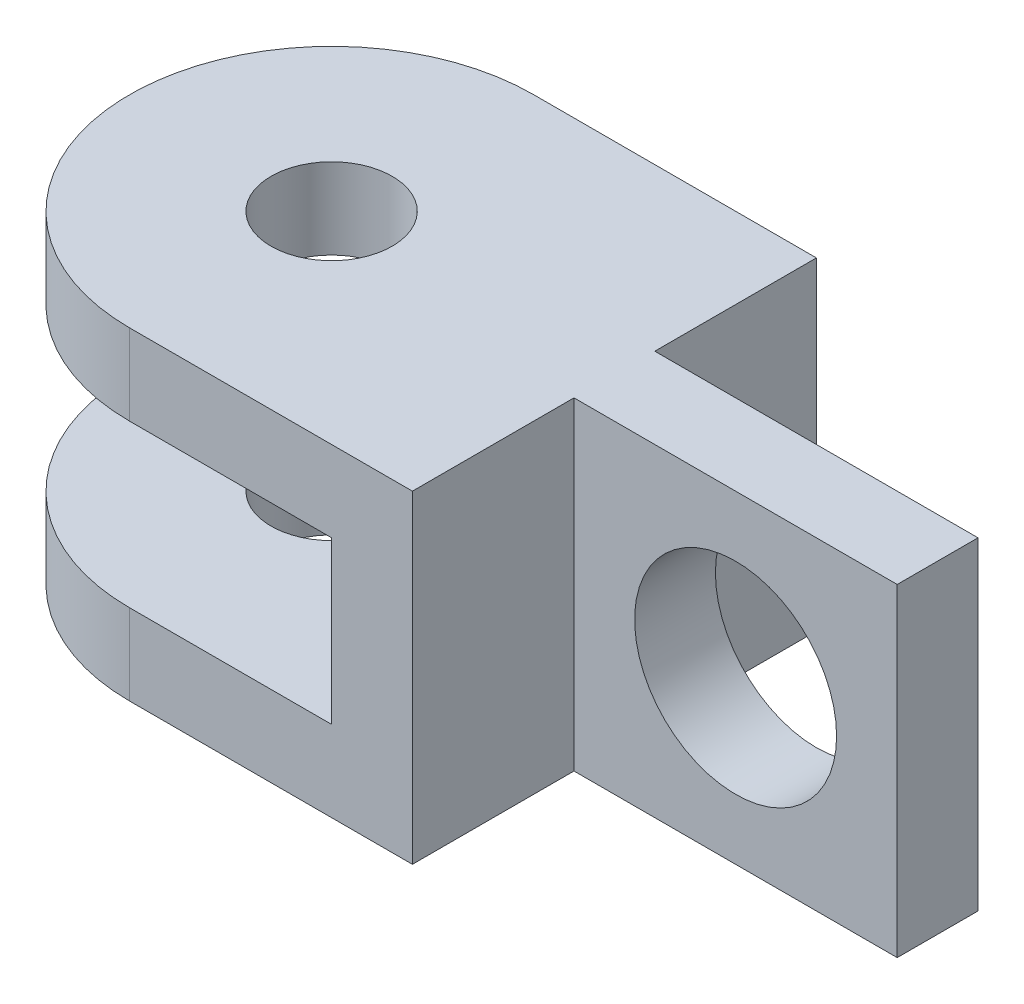
ISO-10303-21;
HEADER;
FILE_DESCRIPTION(('STEP AP214'),'2;1');
FILE_NAME('part.step','',(''),(''),'','','');
FILE_SCHEMA(('AUTOMOTIVE_DESIGN { 1 0 10303 214 1 1 1 1 }'));
ENDSEC;
DATA;
#1=APPLICATION_CONTEXT('core data for automotive mechanical design processes');
#2=APPLICATION_PROTOCOL_DEFINITION('international standard','automotive_design',2000,#1);
#3=PRODUCT_CONTEXT('',#1,'mechanical');
#4=PRODUCT('Part','Part','',(#3));
#5=PRODUCT_RELATED_PRODUCT_CATEGORY('part','',(#4));
#6=PRODUCT_DEFINITION_FORMATION('','',#4);
#7=PRODUCT_DEFINITION_CONTEXT('part definition',#1,'design');
#8=PRODUCT_DEFINITION('design','',#6,#7);
#9=PRODUCT_DEFINITION_SHAPE('','',#8);
#10=(LENGTH_UNIT() NAMED_UNIT(*) SI_UNIT(.MILLI.,.METRE.));
#11=(NAMED_UNIT(*) PLANE_ANGLE_UNIT() SI_UNIT($,.RADIAN.));
#12=(NAMED_UNIT(*) SI_UNIT($,.STERADIAN.) SOLID_ANGLE_UNIT());
#13=UNCERTAINTY_MEASURE_WITH_UNIT(LENGTH_MEASURE(1.E-05),#10,'distance_accuracy_value','');
#14=(GEOMETRIC_REPRESENTATION_CONTEXT(3) GLOBAL_UNCERTAINTY_ASSIGNED_CONTEXT((#13)) GLOBAL_UNIT_ASSIGNED_CONTEXT((#10,
#11,#12)) REPRESENTATION_CONTEXT('',''));
#15=CARTESIAN_POINT('',(0.,0.,0.));
#16=DIRECTION('',(0.,0.,1.));
#17=DIRECTION('',(1.,0.,0.));
#18=AXIS2_PLACEMENT_3D('',#15,#16,#17);
#19=CARTESIAN_POINT('',(200.,80.,0.));
#20=DIRECTION('',(-1.,0.,0.));
#21=DIRECTION('',(0.,0.,1.));
#22=AXIS2_PLACEMENT_3D('',#19,#20,#21);
#23=PLANE('',#22);
#24=DIRECTION('',(0.,-1.,0.));
#25=VECTOR('',#24,1.);
#26=CARTESIAN_POINT('',(200.,80.,40.));
#27=LINE('',#26,#25);
#28=CARTESIAN_POINT('',(200.,80.,40.));
#29=VERTEX_POINT('',#28);
#30=CARTESIAN_POINT('',(200.,0.,40.));
#31=VERTEX_POINT('',#30);
#32=EDGE_CURVE('E150',#29,#31,#27,.T.);
#33=ORIENTED_EDGE('',*,*,#32,.F.);
#34=DIRECTION('',(0.,0.,-1.));
#35=VECTOR('',#34,1.);
#36=CARTESIAN_POINT('',(200.,80.,0.));
#37=LINE('',#36,#35);
#38=CARTESIAN_POINT('',(200.,80.,60.));
#39=VERTEX_POINT('',#38);
#40=EDGE_CURVE('E158',#39,#29,#37,.T.);
#41=ORIENTED_EDGE('',*,*,#40,.F.);
#42=DIRECTION('',(0.,1.,0.));
#43=VECTOR('',#42,1.);
#44=CARTESIAN_POINT('',(200.,80.,60.));
#45=LINE('',#44,#43);
#46=CARTESIAN_POINT('',(200.,0.,60.));
#47=VERTEX_POINT('',#46);
#48=EDGE_CURVE('E209',#47,#39,#45,.T.);
#49=ORIENTED_EDGE('',*,*,#48,.F.);
#50=DIRECTION('',(0.,0.,-1.));
#51=VECTOR('',#50,1.);
#52=CARTESIAN_POINT('',(200.,0.,0.));
#53=LINE('',#52,#51);
#54=EDGE_CURVE('E174',#47,#31,#53,.T.);
#55=ORIENTED_EDGE('',*,*,#54,.T.);
#56=EDGE_LOOP('',(#33,#41,#49,#55));
#57=FACE_BOUND('',#56,.T.);
#58=ADVANCED_FACE('F45',(#57),#23,.F.);
#59=CARTESIAN_POINT('',(160.,40.,0.));
#60=DIRECTION('',(0.,0.,1.));
#61=DIRECTION('',(1.,0.,0.));
#62=AXIS2_PLACEMENT_3D('',#59,#60,#61);
#63=CYLINDRICAL_SURFACE('',#62,25.);
#64=CARTESIAN_POINT('',(160.,40.,60.));
#65=DIRECTION('',(0.,0.,1.));
#66=DIRECTION('',(1.,0.,0.));
#67=AXIS2_PLACEMENT_3D('',#64,#65,#66);
#68=CIRCLE('',#67,25.);
#69=CARTESIAN_POINT('',(185.,40.,60.));
#70=VERTEX_POINT('',#69);
#71=EDGE_CURVE('E206',#70,#70,#68,.F.);
#72=ORIENTED_EDGE('',*,*,#71,.F.);
#73=EDGE_LOOP('',(#72));
#74=FACE_BOUND('',#73,.T.);
#75=CARTESIAN_POINT('',(160.,40.,40.));
#76=DIRECTION('',(0.,0.,-1.));
#77=DIRECTION('',(-1.,0.,0.));
#78=AXIS2_PLACEMENT_3D('',#75,#76,#77);
#79=CIRCLE('',#78,25.);
#80=CARTESIAN_POINT('',(135.,40.,40.));
#81=VERTEX_POINT('',#80);
#82=EDGE_CURVE('E225',#81,#81,#79,.F.);
#83=ORIENTED_EDGE('',*,*,#82,.F.);
#84=EDGE_LOOP('',(#83));
#85=FACE_BOUND('',#84,.T.);
#86=ADVANCED_FACE('F305',(#74,#85),#63,.F.);
#87=CARTESIAN_POINT('',(50.,80.,50.));
#88=DIRECTION('',(0.,-1.,0.));
#89=DIRECTION('',(0.,0.,-1.));
#90=AXIS2_PLACEMENT_3D('',#87,#88,#89);
#91=CYLINDRICAL_SURFACE('',#90,50.);
#92=DIRECTION('',(0.,-1.,0.));
#93=VECTOR('',#92,1.);
#94=CARTESIAN_POINT('',(50.,80.,0.));
#95=LINE('',#94,#93);
#96=CARTESIAN_POINT('',(50.,80.,0.));
#97=VERTEX_POINT('',#96);
#98=CARTESIAN_POINT('',(50.,60.,0.));
#99=VERTEX_POINT('',#98);
#100=EDGE_CURVE('E140',#97,#99,#95,.T.);
#101=ORIENTED_EDGE('',*,*,#100,.T.);
#102=CARTESIAN_POINT('',(50.,60.,50.));
#103=DIRECTION('',(0.,1.,0.));
#104=DIRECTION('',(0.,0.,1.));
#105=AXIS2_PLACEMENT_3D('',#102,#103,#104);
#106=CIRCLE('',#105,50.);
#107=CARTESIAN_POINT('',(50.,60.,100.));
#108=VERTEX_POINT('',#107);
#109=EDGE_CURVE('E205',#99,#108,#106,.T.);
#110=ORIENTED_EDGE('',*,*,#109,.T.);
#111=DIRECTION('',(0.,-1.,0.));
#112=VECTOR('',#111,1.);
#113=CARTESIAN_POINT('',(50.,80.,100.));
#114=LINE('',#113,#112);
#115=CARTESIAN_POINT('',(50.,80.,100.));
#116=VERTEX_POINT('',#115);
#117=EDGE_CURVE('E188',#116,#108,#114,.T.);
#118=ORIENTED_EDGE('',*,*,#117,.F.);
#119=CARTESIAN_POINT('',(50.,80.,50.));
#120=DIRECTION('',(0.,1.,0.));
#121=DIRECTION('',(0.,0.,1.));
#122=AXIS2_PLACEMENT_3D('',#119,#120,#121);
#123=CIRCLE('',#122,50.);
#124=EDGE_CURVE('E157',#97,#116,#123,.T.);
#125=ORIENTED_EDGE('',*,*,#124,.F.);
#126=EDGE_LOOP('',(#101,#110,#118,#125));
#127=FACE_BOUND('',#126,.T.);
#128=ADVANCED_FACE('F302',(#127),#91,.T.);
#129=CARTESIAN_POINT('',(50.,80.,50.));
#130=DIRECTION('',(0.,-1.,0.));
#131=DIRECTION('',(0.,0.,-1.));
#132=AXIS2_PLACEMENT_3D('',#129,#130,#131);
#133=CYLINDRICAL_SURFACE('',#132,15.);
#134=CARTESIAN_POINT('',(50.,60.,50.));
#135=DIRECTION('',(0.,1.,0.));
#136=DIRECTION('',(0.,0.,1.));
#137=AXIS2_PLACEMENT_3D('',#134,#135,#136);
#138=CIRCLE('',#137,15.);
#139=CARTESIAN_POINT('',(50.,60.,65.));
#140=VERTEX_POINT('',#139);
#141=EDGE_CURVE('E201',#140,#140,#138,.T.);
#142=ORIENTED_EDGE('',*,*,#141,.F.);
#143=EDGE_LOOP('',(#142));
#144=FACE_BOUND('',#143,.T.);
#145=CARTESIAN_POINT('',(50.,80.,50.));
#146=DIRECTION('',(0.,1.,0.));
#147=DIRECTION('',(0.,0.,1.));
#148=AXIS2_PLACEMENT_3D('',#145,#146,#147);
#149=CIRCLE('',#148,15.);
#150=CARTESIAN_POINT('',(50.,80.,65.));
#151=VERTEX_POINT('',#150);
#152=EDGE_CURVE('E179',#151,#151,#149,.T.);
#153=ORIENTED_EDGE('',*,*,#152,.T.);
#154=EDGE_LOOP('',(#153));
#155=FACE_BOUND('',#154,.T.);
#156=ADVANCED_FACE('F289',(#144,#155),#133,.F.);
#157=CARTESIAN_POINT('',(50.,80.,50.));
#158=DIRECTION('',(0.,1.,0.));
#159=DIRECTION('',(0.,0.,1.));
#160=AXIS2_PLACEMENT_3D('',#157,#158,#159);
#161=PLANE('',#160);
#162=DIRECTION('',(0.,0.,1.));
#163=VECTOR('',#162,1.);
#164=CARTESIAN_POINT('',(120.,80.,50.));
#165=LINE('',#164,#163);
#166=CARTESIAN_POINT('',(120.,80.,0.));
#167=VERTEX_POINT('',#166);
#168=CARTESIAN_POINT('',(120.,80.,40.));
#169=VERTEX_POINT('',#168);
#170=EDGE_CURVE('E134',#167,#169,#165,.T.);
#171=ORIENTED_EDGE('',*,*,#170,.F.);
#172=DIRECTION('',(-1.,0.,0.));
#173=VECTOR('',#172,1.);
#174=CARTESIAN_POINT('',(50.,80.,0.));
#175=LINE('',#174,#173);
#176=EDGE_CURVE('E145',#167,#97,#175,.T.);
#177=ORIENTED_EDGE('',*,*,#176,.T.);
#178=ORIENTED_EDGE('',*,*,#124,.T.);
#179=DIRECTION('',(1.,0.,0.));
#180=VECTOR('',#179,1.);
#181=CARTESIAN_POINT('',(50.,80.,100.));
#182=LINE('',#181,#180);
#183=CARTESIAN_POINT('',(120.,80.,100.));
#184=VERTEX_POINT('',#183);
#185=EDGE_CURVE('E163',#116,#184,#182,.T.);
#186=ORIENTED_EDGE('',*,*,#185,.T.);
#187=DIRECTION('',(0.,0.,1.));
#188=VECTOR('',#187,1.);
#189=CARTESIAN_POINT('',(120.,80.,50.));
#190=LINE('',#189,#188);
#191=CARTESIAN_POINT('',(120.,80.,60.));
#192=VERTEX_POINT('',#191);
#193=EDGE_CURVE('E68',#192,#184,#190,.T.);
#194=ORIENTED_EDGE('',*,*,#193,.F.);
#195=DIRECTION('',(1.,0.,0.));
#196=VECTOR('',#195,1.);
#197=CARTESIAN_POINT('',(50.,80.,60.));
#198=LINE('',#197,#196);
#199=EDGE_CURVE('E232',#192,#39,#198,.T.);
#200=ORIENTED_EDGE('',*,*,#199,.T.);
#201=ORIENTED_EDGE('',*,*,#40,.T.);
#202=DIRECTION('',(-1.,0.,0.));
#203=VECTOR('',#202,1.);
#204=CARTESIAN_POINT('',(50.,80.,40.));
#205=LINE('',#204,#203);
#206=EDGE_CURVE('E148',#29,#169,#205,.T.);
#207=ORIENTED_EDGE('',*,*,#206,.T.);
#208=EDGE_LOOP('',(#171,#177,#178,#186,#194,#200,#201,#207));
#209=FACE_BOUND('',#208,.T.);
#210=ORIENTED_EDGE('',*,*,#152,.F.);
#211=EDGE_LOOP('',(#210));
#212=FACE_BOUND('',#211,.T.);
#213=ADVANCED_FACE('F143',(#209,#212),#161,.T.);
#214=CARTESIAN_POINT('',(50.,0.,50.));
#215=DIRECTION('',(0.,1.,0.));
#216=DIRECTION('',(0.,0.,1.));
#217=AXIS2_PLACEMENT_3D('',#214,#215,#216);
#218=PLANE('',#217);
#219=DIRECTION('',(-1.,0.,0.));
#220=VECTOR('',#219,1.);
#221=CARTESIAN_POINT('',(50.,0.,0.));
#222=LINE('',#221,#220);
#223=CARTESIAN_POINT('',(120.,0.,0.));
#224=VERTEX_POINT('',#223);
#225=CARTESIAN_POINT('',(50.,0.,0.));
#226=VERTEX_POINT('',#225);
#227=EDGE_CURVE('E178',#224,#226,#222,.T.);
#228=ORIENTED_EDGE('',*,*,#227,.F.);
#229=DIRECTION('',(0.,0.,1.));
#230=VECTOR('',#229,1.);
#231=CARTESIAN_POINT('',(120.,0.,50.));
#232=LINE('',#231,#230);
#233=CARTESIAN_POINT('',(120.,0.,40.));
#234=VERTEX_POINT('',#233);
#235=EDGE_CURVE('E60',#224,#234,#232,.T.);
#236=ORIENTED_EDGE('',*,*,#235,.T.);
#237=DIRECTION('',(-1.,0.,0.));
#238=VECTOR('',#237,1.);
#239=CARTESIAN_POINT('',(50.,0.,40.));
#240=LINE('',#239,#238);
#241=EDGE_CURVE('E11',#31,#234,#240,.T.);
#242=ORIENTED_EDGE('',*,*,#241,.F.);
#243=ORIENTED_EDGE('',*,*,#54,.F.);
#244=DIRECTION('',(1.,0.,0.));
#245=VECTOR('',#244,1.);
#246=CARTESIAN_POINT('',(50.,0.,60.));
#247=LINE('',#246,#245);
#248=CARTESIAN_POINT('',(120.,0.,60.));
#249=VERTEX_POINT('',#248);
#250=EDGE_CURVE('E215',#249,#47,#247,.T.);
#251=ORIENTED_EDGE('',*,*,#250,.F.);
#252=DIRECTION('',(0.,0.,1.));
#253=VECTOR('',#252,1.);
#254=CARTESIAN_POINT('',(120.,0.,50.));
#255=LINE('',#254,#253);
#256=CARTESIAN_POINT('',(120.,0.,100.));
#257=VERTEX_POINT('',#256);
#258=EDGE_CURVE('E236',#249,#257,#255,.T.);
#259=ORIENTED_EDGE('',*,*,#258,.T.);
#260=DIRECTION('',(1.,0.,0.));
#261=VECTOR('',#260,1.);
#262=CARTESIAN_POINT('',(50.,0.,100.));
#263=LINE('',#262,#261);
#264=CARTESIAN_POINT('',(50.,0.,100.));
#265=VERTEX_POINT('',#264);
#266=EDGE_CURVE('E166',#265,#257,#263,.T.);
#267=ORIENTED_EDGE('',*,*,#266,.F.);
#268=CARTESIAN_POINT('',(50.,0.,50.));
#269=DIRECTION('',(0.,1.,0.));
#270=DIRECTION('',(0.,0.,1.));
#271=AXIS2_PLACEMENT_3D('',#268,#269,#270);
#272=CIRCLE('',#271,50.);
#273=EDGE_CURVE('E181',#226,#265,#272,.T.);
#274=ORIENTED_EDGE('',*,*,#273,.F.);
#275=EDGE_LOOP('',(#228,#236,#242,#243,#251,#259,#267,#274));
#276=FACE_BOUND('',#275,.T.);
#277=CARTESIAN_POINT('',(50.,0.,50.));
#278=DIRECTION('',(0.,1.,0.));
#279=DIRECTION('',(0.,0.,1.));
#280=AXIS2_PLACEMENT_3D('',#277,#278,#279);
#281=CIRCLE('',#280,15.);
#282=CARTESIAN_POINT('',(50.,0.,65.));
#283=VERTEX_POINT('',#282);
#284=EDGE_CURVE('E274',#283,#283,#281,.T.);
#285=ORIENTED_EDGE('',*,*,#284,.T.);
#286=EDGE_LOOP('',(#285));
#287=FACE_BOUND('',#286,.T.);
#288=ADVANCED_FACE('F281',(#276,#287),#218,.F.);
#289=CARTESIAN_POINT('',(50.,80.,0.));
#290=DIRECTION('',(0.,0.,1.));
#291=DIRECTION('',(1.,0.,0.));
#292=AXIS2_PLACEMENT_3D('',#289,#290,#291);
#293=PLANE('',#292);
#294=ORIENTED_EDGE('',*,*,#176,.F.);
#295=DIRECTION('',(0.,-1.,0.));
#296=VECTOR('',#295,1.);
#297=CARTESIAN_POINT('',(120.,80.,0.));
#298=LINE('',#297,#296);
#299=EDGE_CURVE('E53',#167,#224,#298,.T.);
#300=ORIENTED_EDGE('',*,*,#299,.T.);
#301=ORIENTED_EDGE('',*,*,#227,.T.);
#302=CARTESIAN_POINT('',(50.,20.,0.));
#303=VERTEX_POINT('',#302);
#304=EDGE_CURVE('E192',#303,#226,#95,.T.);
#305=ORIENTED_EDGE('',*,*,#304,.F.);
#306=DIRECTION('',(1.,0.,0.));
#307=VECTOR('',#306,1.);
#308=CARTESIAN_POINT('',(-100.,20.,0.));
#309=LINE('',#308,#307);
#310=CARTESIAN_POINT('',(100.,20.,0.));
#311=VERTEX_POINT('',#310);
#312=EDGE_CURVE('E254',#303,#311,#309,.T.);
#313=ORIENTED_EDGE('',*,*,#312,.T.);
#314=DIRECTION('',(0.,1.,0.));
#315=VECTOR('',#314,1.);
#316=CARTESIAN_POINT('',(100.,60.,0.));
#317=LINE('',#316,#315);
#318=CARTESIAN_POINT('',(100.,60.,0.));
#319=VERTEX_POINT('',#318);
#320=EDGE_CURVE('E261',#311,#319,#317,.T.);
#321=ORIENTED_EDGE('',*,*,#320,.T.);
#322=DIRECTION('',(-1.,0.,0.));
#323=VECTOR('',#322,1.);
#324=CARTESIAN_POINT('',(-100.,60.,0.));
#325=LINE('',#324,#323);
#326=EDGE_CURVE('E247',#319,#99,#325,.T.);
#327=ORIENTED_EDGE('',*,*,#326,.T.);
#328=ORIENTED_EDGE('',*,*,#100,.F.);
#329=EDGE_LOOP('',(#294,#300,#301,#305,#313,#321,#327,#328));
#330=FACE_BOUND('',#329,.T.);
#331=ADVANCED_FACE('F152',(#330),#293,.F.);
#332=CARTESIAN_POINT('',(50.,20.,100.));
#333=VERTEX_POINT('',#332);
#334=EDGE_CURVE('E173',#333,#265,#114,.T.);
#335=ORIENTED_EDGE('',*,*,#334,.F.);
#336=CARTESIAN_POINT('',(50.,20.,50.));
#337=DIRECTION('',(0.,-1.,0.));
#338=DIRECTION('',(0.,0.,-1.));
#339=AXIS2_PLACEMENT_3D('',#336,#337,#338);
#340=CIRCLE('',#339,50.);
#341=EDGE_CURVE('E199',#333,#303,#340,.T.);
#342=ORIENTED_EDGE('',*,*,#341,.T.);
#343=ORIENTED_EDGE('',*,*,#304,.T.);
#344=ORIENTED_EDGE('',*,*,#273,.T.);
#345=EDGE_LOOP('',(#335,#342,#343,#344));
#346=FACE_BOUND('',#345,.T.);
#347=ADVANCED_FACE('F296',(#346),#91,.T.);
#348=CARTESIAN_POINT('',(50.,80.,100.));
#349=DIRECTION('',(0.,0.,-1.));
#350=DIRECTION('',(-1.,0.,0.));
#351=AXIS2_PLACEMENT_3D('',#348,#349,#350);
#352=PLANE('',#351);
#353=ORIENTED_EDGE('',*,*,#266,.T.);
#354=DIRECTION('',(0.,-1.,0.));
#355=VECTOR('',#354,1.);
#356=CARTESIAN_POINT('',(120.,90.,100.));
#357=LINE('',#356,#355);
#358=EDGE_CURVE('E219',#184,#257,#357,.T.);
#359=ORIENTED_EDGE('',*,*,#358,.F.);
#360=ORIENTED_EDGE('',*,*,#185,.F.);
#361=ORIENTED_EDGE('',*,*,#117,.T.);
#362=DIRECTION('',(-1.,0.,0.));
#363=VECTOR('',#362,1.);
#364=CARTESIAN_POINT('',(-100.,60.,100.));
#365=LINE('',#364,#363);
#366=CARTESIAN_POINT('',(100.,60.,100.));
#367=VERTEX_POINT('',#366);
#368=EDGE_CURVE('E250',#367,#108,#365,.T.);
#369=ORIENTED_EDGE('',*,*,#368,.F.);
#370=DIRECTION('',(0.,1.,0.));
#371=VECTOR('',#370,1.);
#372=CARTESIAN_POINT('',(100.,60.,100.));
#373=LINE('',#372,#371);
#374=CARTESIAN_POINT('',(100.,20.,100.));
#375=VERTEX_POINT('',#374);
#376=EDGE_CURVE('E253',#375,#367,#373,.T.);
#377=ORIENTED_EDGE('',*,*,#376,.F.);
#378=DIRECTION('',(1.,0.,0.));
#379=VECTOR('',#378,1.);
#380=CARTESIAN_POINT('',(-100.,20.,100.));
#381=LINE('',#380,#379);
#382=EDGE_CURVE('E200',#333,#375,#381,.T.);
#383=ORIENTED_EDGE('',*,*,#382,.F.);
#384=ORIENTED_EDGE('',*,*,#334,.T.);
#385=EDGE_LOOP('',(#353,#359,#360,#361,#369,#377,#383,#384));
#386=FACE_BOUND('',#385,.T.);
#387=ADVANCED_FACE('F286',(#386),#352,.F.);
#388=CARTESIAN_POINT('',(50.,20.,50.));
#389=DIRECTION('',(0.,-1.,0.));
#390=DIRECTION('',(0.,0.,-1.));
#391=AXIS2_PLACEMENT_3D('',#388,#389,#390);
#392=CIRCLE('',#391,15.);
#393=CARTESIAN_POINT('',(50.,20.,35.));
#394=VERTEX_POINT('',#393);
#395=EDGE_CURVE('E195',#394,#394,#392,.T.);
#396=ORIENTED_EDGE('',*,*,#395,.F.);
#397=EDGE_LOOP('',(#396));
#398=FACE_BOUND('',#397,.T.);
#399=ORIENTED_EDGE('',*,*,#284,.F.);
#400=EDGE_LOOP('',(#399));
#401=FACE_BOUND('',#400,.T.);
#402=ADVANCED_FACE('F283',(#398,#401),#133,.F.);
#403=CARTESIAN_POINT('',(-100.,60.,0.));
#404=DIRECTION('',(0.,1.,0.));
#405=DIRECTION('',(0.,0.,1.));
#406=AXIS2_PLACEMENT_3D('',#403,#404,#405);
#407=PLANE('',#406);
#408=ORIENTED_EDGE('',*,*,#141,.T.);
#409=EDGE_LOOP('',(#408));
#410=FACE_BOUND('',#409,.T.);
#411=ORIENTED_EDGE('',*,*,#326,.F.);
#412=DIRECTION('',(0.,0.,1.));
#413=VECTOR('',#412,1.);
#414=CARTESIAN_POINT('',(100.,60.,0.));
#415=LINE('',#414,#413);
#416=EDGE_CURVE('E242',#319,#367,#415,.T.);
#417=ORIENTED_EDGE('',*,*,#416,.T.);
#418=ORIENTED_EDGE('',*,*,#368,.T.);
#419=ORIENTED_EDGE('',*,*,#109,.F.);
#420=EDGE_LOOP('',(#411,#417,#418,#419));
#421=FACE_BOUND('',#420,.T.);
#422=ADVANCED_FACE('F285',(#410,#421),#407,.F.);
#423=CARTESIAN_POINT('',(-100.,20.,0.));
#424=DIRECTION('',(0.,-1.,0.));
#425=DIRECTION('',(0.,0.,-1.));
#426=AXIS2_PLACEMENT_3D('',#423,#424,#425);
#427=PLANE('',#426);
#428=ORIENTED_EDGE('',*,*,#395,.T.);
#429=EDGE_LOOP('',(#428));
#430=FACE_BOUND('',#429,.T.);
#431=ORIENTED_EDGE('',*,*,#382,.T.);
#432=DIRECTION('',(0.,0.,1.));
#433=VECTOR('',#432,1.);
#434=CARTESIAN_POINT('',(100.,20.,0.));
#435=LINE('',#434,#433);
#436=EDGE_CURVE('E243',#311,#375,#435,.T.);
#437=ORIENTED_EDGE('',*,*,#436,.F.);
#438=ORIENTED_EDGE('',*,*,#312,.F.);
#439=ORIENTED_EDGE('',*,*,#341,.F.);
#440=EDGE_LOOP('',(#431,#437,#438,#439));
#441=FACE_BOUND('',#440,.T.);
#442=ADVANCED_FACE('F293',(#430,#441),#427,.F.);
#443=CARTESIAN_POINT('',(100.,60.,0.));
#444=DIRECTION('',(1.,0.,0.));
#445=DIRECTION('',(0.,0.,-1.));
#446=AXIS2_PLACEMENT_3D('',#443,#444,#445);
#447=PLANE('',#446);
#448=ORIENTED_EDGE('',*,*,#376,.T.);
#449=ORIENTED_EDGE('',*,*,#416,.F.);
#450=ORIENTED_EDGE('',*,*,#320,.F.);
#451=ORIENTED_EDGE('',*,*,#436,.T.);
#452=EDGE_LOOP('',(#448,#449,#450,#451));
#453=FACE_BOUND('',#452,.T.);
#454=ADVANCED_FACE('F352',(#453),#447,.F.);
#455=CARTESIAN_POINT('',(120.,90.,60.));
#456=DIRECTION('',(-1.,0.,0.));
#457=DIRECTION('',(0.,-1.,0.));
#458=AXIS2_PLACEMENT_3D('',#455,#456,#457);
#459=PLANE('',#458);
#460=ORIENTED_EDGE('',*,*,#193,.T.);
#461=ORIENTED_EDGE('',*,*,#358,.T.);
#462=ORIENTED_EDGE('',*,*,#258,.F.);
#463=DIRECTION('',(0.,-1.,0.));
#464=VECTOR('',#463,1.);
#465=CARTESIAN_POINT('',(120.,90.,60.));
#466=LINE('',#465,#464);
#467=EDGE_CURVE('E210',#192,#249,#466,.T.);
#468=ORIENTED_EDGE('',*,*,#467,.F.);
#469=EDGE_LOOP('',(#460,#461,#462,#468));
#470=FACE_BOUND('',#469,.T.);
#471=ADVANCED_FACE('F320',(#470),#459,.F.);
#472=CARTESIAN_POINT('',(0.,0.,60.));
#473=DIRECTION('',(0.,0.,1.));
#474=DIRECTION('',(1.,0.,0.));
#475=AXIS2_PLACEMENT_3D('',#472,#473,#474);
#476=PLANE('',#475);
#477=ORIENTED_EDGE('',*,*,#467,.T.);
#478=ORIENTED_EDGE('',*,*,#250,.T.);
#479=ORIENTED_EDGE('',*,*,#48,.T.);
#480=ORIENTED_EDGE('',*,*,#199,.F.);
#481=EDGE_LOOP('',(#477,#478,#479,#480));
#482=FACE_BOUND('',#481,.T.);
#483=ORIENTED_EDGE('',*,*,#71,.T.);
#484=EDGE_LOOP('',(#483));
#485=FACE_BOUND('',#484,.T.);
#486=ADVANCED_FACE('F319',(#482,#485),#476,.T.);
#487=CARTESIAN_POINT('',(0.,0.,40.));
#488=DIRECTION('',(0.,0.,-1.));
#489=DIRECTION('',(-1.,0.,0.));
#490=AXIS2_PLACEMENT_3D('',#487,#488,#489);
#491=PLANE('',#490);
#492=ORIENTED_EDGE('',*,*,#32,.T.);
#493=ORIENTED_EDGE('',*,*,#241,.T.);
#494=DIRECTION('',(0.,1.,0.));
#495=VECTOR('',#494,1.);
#496=CARTESIAN_POINT('',(120.,90.,40.));
#497=LINE('',#496,#495);
#498=EDGE_CURVE('E337',#234,#169,#497,.T.);
#499=ORIENTED_EDGE('',*,*,#498,.T.);
#500=ORIENTED_EDGE('',*,*,#206,.F.);
#501=EDGE_LOOP('',(#492,#493,#499,#500));
#502=FACE_BOUND('',#501,.T.);
#503=ORIENTED_EDGE('',*,*,#82,.T.);
#504=EDGE_LOOP('',(#503));
#505=FACE_BOUND('',#504,.T.);
#506=ADVANCED_FACE('F339',(#502,#505),#491,.T.);
#507=CARTESIAN_POINT('',(120.,90.,40.));
#508=DIRECTION('',(-1.,0.,0.));
#509=DIRECTION('',(0.,-1.,0.));
#510=AXIS2_PLACEMENT_3D('',#507,#508,#509);
#511=PLANE('',#510);
#512=ORIENTED_EDGE('',*,*,#170,.T.);
#513=ORIENTED_EDGE('',*,*,#498,.F.);
#514=ORIENTED_EDGE('',*,*,#235,.F.);
#515=ORIENTED_EDGE('',*,*,#299,.F.);
#516=EDGE_LOOP('',(#512,#513,#514,#515));
#517=FACE_BOUND('',#516,.T.);
#518=ADVANCED_FACE('F133',(#517),#511,.F.);
#519=CLOSED_SHELL('',(#58,#86,#128,#156,#213,#288,#331,#347,#387,#402,#422,#442,#454,#471,#486,
#506,#518));
#520=MANIFOLD_SOLID_BREP('B2',#519);
#521=ADVANCED_BREP_SHAPE_REPRESENTATION('',(#18,#520),#14);
#522=SHAPE_DEFINITION_REPRESENTATION(#9,#521);
ENDSEC;
END-ISO-10303-21;
